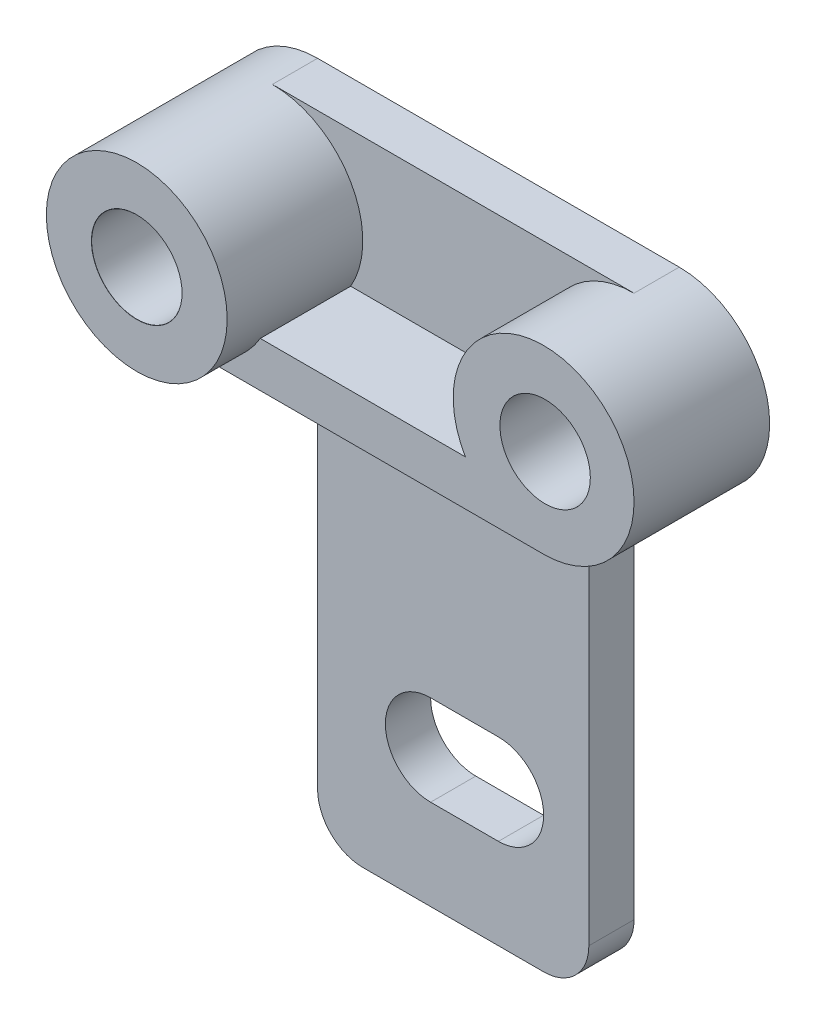
ISO-10303-21;
HEADER;
FILE_DESCRIPTION(('STEP AP214'),'2;1');
FILE_NAME('part.step','',(''),(''),'','','');
FILE_SCHEMA(('AUTOMOTIVE_DESIGN { 1 0 10303 214 1 1 1 1 }'));
ENDSEC;
DATA;
#1=APPLICATION_CONTEXT('core data for automotive mechanical design processes');
#2=APPLICATION_PROTOCOL_DEFINITION('international standard','automotive_design',2000,#1);
#3=PRODUCT_CONTEXT('',#1,'mechanical');
#4=PRODUCT('Part','Part','',(#3));
#5=PRODUCT_RELATED_PRODUCT_CATEGORY('part','',(#4));
#6=PRODUCT_DEFINITION_FORMATION('','',#4);
#7=PRODUCT_DEFINITION_CONTEXT('part definition',#1,'design');
#8=PRODUCT_DEFINITION('design','',#6,#7);
#9=PRODUCT_DEFINITION_SHAPE('','',#8);
#10=(LENGTH_UNIT() NAMED_UNIT(*) SI_UNIT(.MILLI.,.METRE.));
#11=(NAMED_UNIT(*) PLANE_ANGLE_UNIT() SI_UNIT($,.RADIAN.));
#12=(NAMED_UNIT(*) SI_UNIT($,.STERADIAN.) SOLID_ANGLE_UNIT());
#13=UNCERTAINTY_MEASURE_WITH_UNIT(LENGTH_MEASURE(1.E-05),#10,'distance_accuracy_value','');
#14=(GEOMETRIC_REPRESENTATION_CONTEXT(3) GLOBAL_UNCERTAINTY_ASSIGNED_CONTEXT((#13)) GLOBAL_UNIT_ASSIGNED_CONTEXT((#10,
#11,#12)) REPRESENTATION_CONTEXT('',''));
#15=CARTESIAN_POINT('',(0.,0.,0.));
#16=DIRECTION('',(0.,0.,1.));
#17=DIRECTION('',(1.,0.,0.));
#18=AXIS2_PLACEMENT_3D('',#15,#16,#17);
#19=CARTESIAN_POINT('',(-40.,0.,40.));
#20=DIRECTION('',(0.,0.,-1.));
#21=DIRECTION('',(-1.,0.,0.));
#22=AXIS2_PLACEMENT_3D('',#19,#20,#21);
#23=CYLINDRICAL_SURFACE('',#22,20.);
#24=CARTESIAN_POINT('',(-40.,0.,30.));
#25=DIRECTION('',(0.,0.,1.));
#26=DIRECTION('',(1.,0.,0.));
#27=AXIS2_PLACEMENT_3D('',#24,#25,#26);
#28=CIRCLE('',#27,20.);
#29=CARTESIAN_POINT('',(-40.,-20.,30.));
#30=VERTEX_POINT('',#29);
#31=CARTESIAN_POINT('',(-22.6794919243112,-10.,30.));
#32=VERTEX_POINT('',#31);
#33=EDGE_CURVE('E277',#30,#32,#28,.T.);
#34=ORIENTED_EDGE('',*,*,#33,.T.);
#35=DIRECTION('',(0.,0.,-1.));
#36=VECTOR('',#35,1.);
#37=CARTESIAN_POINT('',(-22.6794919243112,-10.,40.));
#38=LINE('',#37,#36);
#39=CARTESIAN_POINT('',(-22.6794919243112,-10.,10.));
#40=VERTEX_POINT('',#39);
#41=EDGE_CURVE('E273',#32,#40,#38,.T.);
#42=ORIENTED_EDGE('',*,*,#41,.T.);
#43=CARTESIAN_POINT('',(-40.,0.,10.));
#44=DIRECTION('',(0.,0.,-1.));
#45=DIRECTION('',(-1.,0.,0.));
#46=AXIS2_PLACEMENT_3D('',#43,#44,#45);
#47=CIRCLE('',#46,20.);
#48=CARTESIAN_POINT('',(-40.,20.,10.));
#49=VERTEX_POINT('',#48);
#50=EDGE_CURVE('E322',#49,#40,#47,.T.);
#51=ORIENTED_EDGE('',*,*,#50,.F.);
#52=DIRECTION('',(0.,0.,-1.));
#53=VECTOR('',#52,1.);
#54=CARTESIAN_POINT('',(-40.,20.,10.));
#55=LINE('',#54,#53);
#56=CARTESIAN_POINT('',(-40.,20.,0.));
#57=VERTEX_POINT('',#56);
#58=EDGE_CURVE('E307',#49,#57,#55,.T.);
#59=ORIENTED_EDGE('',*,*,#58,.T.);
#60=CARTESIAN_POINT('',(-40.,0.,0.));
#61=DIRECTION('',(0.,0.,1.));
#62=DIRECTION('',(1.,0.,0.));
#63=AXIS2_PLACEMENT_3D('',#60,#61,#62);
#64=CIRCLE('',#63,20.);
#65=CARTESIAN_POINT('',(-40.,-20.,0.));
#66=VERTEX_POINT('',#65);
#67=EDGE_CURVE('E306',#57,#66,#64,.T.);
#68=ORIENTED_EDGE('',*,*,#67,.T.);
#69=DIRECTION('',(0.,0.,-1.));
#70=VECTOR('',#69,1.);
#71=CARTESIAN_POINT('',(-40.,-20.,10.));
#72=LINE('',#71,#70);
#73=EDGE_CURVE('E311',#30,#66,#72,.T.);
#74=ORIENTED_EDGE('',*,*,#73,.F.);
#75=EDGE_LOOP('',(#34,#42,#51,#59,#68,#74));
#76=FACE_BOUND('',#75,.T.);
#77=CARTESIAN_POINT('',(-40.,0.,40.));
#78=DIRECTION('',(0.,0.,1.));
#79=DIRECTION('',(1.,0.,0.));
#80=AXIS2_PLACEMENT_3D('',#77,#78,#79);
#81=CIRCLE('',#80,20.);
#82=CARTESIAN_POINT('',(-20.,0.,40.));
#83=VERTEX_POINT('',#82);
#84=EDGE_CURVE('E318',#83,#83,#81,.T.);
#85=ORIENTED_EDGE('',*,*,#84,.F.);
#86=EDGE_LOOP('',(#85));
#87=FACE_BOUND('',#86,.T.);
#88=ADVANCED_FACE('F45',(#76,#87),#23,.T.);
#89=CARTESIAN_POINT('',(-40.,0.,40.));
#90=DIRECTION('',(0.,0.,1.));
#91=DIRECTION('',(1.,0.,0.));
#92=AXIS2_PLACEMENT_3D('',#89,#90,#91);
#93=PLANE('',#92);
#94=CARTESIAN_POINT('',(-40.,0.,40.));
#95=DIRECTION('',(0.,0.,1.));
#96=DIRECTION('',(1.,0.,0.));
#97=AXIS2_PLACEMENT_3D('',#94,#95,#96);
#98=CIRCLE('',#97,10.025);
#99=CARTESIAN_POINT('',(-29.975,0.,40.));
#100=VERTEX_POINT('',#99);
#101=EDGE_CURVE('E234',#100,#100,#98,.T.);
#102=ORIENTED_EDGE('',*,*,#101,.F.);
#103=EDGE_LOOP('',(#102));
#104=FACE_BOUND('',#103,.T.);
#105=ORIENTED_EDGE('',*,*,#84,.T.);
#106=EDGE_LOOP('',(#105));
#107=FACE_BOUND('',#106,.T.);
#108=ADVANCED_FACE('F408',(#104,#107),#93,.T.);
#109=CARTESIAN_POINT('',(-40.,0.,0.));
#110=DIRECTION('',(0.,0.,1.));
#111=DIRECTION('',(1.,0.,0.));
#112=AXIS2_PLACEMENT_3D('',#109,#110,#111);
#113=PLANE('',#112);
#114=DIRECTION('',(1.,0.,0.));
#115=VECTOR('',#114,1.);
#116=CARTESIAN_POINT('',(-5.,-80.,0.));
#117=LINE('',#116,#115);
#118=CARTESIAN_POINT('',(-5.,-80.,0.));
#119=VERTEX_POINT('',#118);
#120=CARTESIAN_POINT('',(10.,-80.,0.));
#121=VERTEX_POINT('',#120);
#122=EDGE_CURVE('E180',#119,#121,#117,.T.);
#123=ORIENTED_EDGE('',*,*,#122,.F.);
#124=CARTESIAN_POINT('',(-5.,-90.,0.));
#125=DIRECTION('',(0.,0.,1.));
#126=DIRECTION('',(1.,0.,0.));
#127=AXIS2_PLACEMENT_3D('',#124,#125,#126);
#128=CIRCLE('',#127,9.99999999999999);
#129=CARTESIAN_POINT('',(-5.,-100.,0.));
#130=VERTEX_POINT('',#129);
#131=EDGE_CURVE('E160',#130,#119,#128,.F.);
#132=ORIENTED_EDGE('',*,*,#131,.F.);
#133=DIRECTION('',(-1.,0.,0.));
#134=VECTOR('',#133,1.);
#135=CARTESIAN_POINT('',(-5.,-100.,0.));
#136=LINE('',#135,#134);
#137=CARTESIAN_POINT('',(9.99999999999999,-100.,0.));
#138=VERTEX_POINT('',#137);
#139=EDGE_CURVE('E170',#138,#130,#136,.T.);
#140=ORIENTED_EDGE('',*,*,#139,.F.);
#141=CARTESIAN_POINT('',(10.,-90.,0.));
#142=DIRECTION('',(0.,0.,1.));
#143=DIRECTION('',(1.,0.,0.));
#144=AXIS2_PLACEMENT_3D('',#141,#142,#143);
#145=CIRCLE('',#144,9.99999999999999);
#146=EDGE_CURVE('E61',#121,#138,#145,.F.);
#147=ORIENTED_EDGE('',*,*,#146,.F.);
#148=EDGE_LOOP('',(#123,#132,#140,#147));
#149=FACE_BOUND('',#148,.T.);
#150=CARTESIAN_POINT('',(-40.,0.,0.));
#151=DIRECTION('',(0.,0.,1.));
#152=DIRECTION('',(1.,0.,0.));
#153=AXIS2_PLACEMENT_3D('',#150,#151,#152);
#154=CIRCLE('',#153,9.99999999999999);
#155=CARTESIAN_POINT('',(-30.,0.,0.));
#156=VERTEX_POINT('',#155);
#157=EDGE_CURVE('E245',#156,#156,#154,.T.);
#158=ORIENTED_EDGE('',*,*,#157,.T.);
#159=EDGE_LOOP('',(#158));
#160=FACE_BOUND('',#159,.T.);
#161=CARTESIAN_POINT('',(40.3313513238807,-0.177410636321921,0.));
#162=DIRECTION('',(0.,0.,1.));
#163=DIRECTION('',(1.,0.,0.));
#164=AXIS2_PLACEMENT_3D('',#161,#162,#163);
#165=CIRCLE('',#164,9.99999999999999);
#166=CARTESIAN_POINT('',(50.3313513238806,-0.177410636321921,0.));
#167=VERTEX_POINT('',#166);
#168=EDGE_CURVE('E249',#167,#167,#165,.T.);
#169=ORIENTED_EDGE('',*,*,#168,.T.);
#170=EDGE_LOOP('',(#169));
#171=FACE_BOUND('',#170,.T.);
#172=DIRECTION('',(0.,-1.,0.));
#173=VECTOR('',#172,1.);
#174=CARTESIAN_POINT('',(30.,-20.,0.));
#175=LINE('',#174,#173);
#176=CARTESIAN_POINT('',(30.,-20.,0.));
#177=VERTEX_POINT('',#176);
#178=CARTESIAN_POINT('',(30.,-110.,0.));
#179=VERTEX_POINT('',#178);
#180=EDGE_CURVE('E174',#177,#179,#175,.T.);
#181=ORIENTED_EDGE('',*,*,#180,.T.);
#182=CARTESIAN_POINT('',(20.,-110.,0.));
#183=DIRECTION('',(0.,0.,1.));
#184=DIRECTION('',(1.,0.,0.));
#185=AXIS2_PLACEMENT_3D('',#182,#183,#184);
#186=CIRCLE('',#185,10.);
#187=CARTESIAN_POINT('',(20.,-120.,0.));
#188=VERTEX_POINT('',#187);
#189=EDGE_CURVE('E351',#179,#188,#186,.F.);
#190=ORIENTED_EDGE('',*,*,#189,.T.);
#191=DIRECTION('',(-1.,0.,0.));
#192=VECTOR('',#191,1.);
#193=CARTESIAN_POINT('',(30.,-120.,0.));
#194=LINE('',#193,#192);
#195=CARTESIAN_POINT('',(-20.,-120.,0.));
#196=VERTEX_POINT('',#195);
#197=EDGE_CURVE('E225',#188,#196,#194,.T.);
#198=ORIENTED_EDGE('',*,*,#197,.T.);
#199=CARTESIAN_POINT('',(-20.,-110.,0.));
#200=DIRECTION('',(0.,0.,1.));
#201=DIRECTION('',(1.,0.,0.));
#202=AXIS2_PLACEMENT_3D('',#199,#200,#201);
#203=CIRCLE('',#202,10.);
#204=CARTESIAN_POINT('',(-30.,-110.,0.));
#205=VERTEX_POINT('',#204);
#206=EDGE_CURVE('E337',#196,#205,#203,.F.);
#207=ORIENTED_EDGE('',*,*,#206,.T.);
#208=DIRECTION('',(0.,1.,0.));
#209=VECTOR('',#208,1.);
#210=CARTESIAN_POINT('',(-30.,-20.,0.));
#211=LINE('',#210,#209);
#212=CARTESIAN_POINT('',(-30.,-20.,0.));
#213=VERTEX_POINT('',#212);
#214=EDGE_CURVE('E211',#205,#213,#211,.T.);
#215=ORIENTED_EDGE('',*,*,#214,.T.);
#216=DIRECTION('',(-1.,0.,0.));
#217=VECTOR('',#216,1.);
#218=CARTESIAN_POINT('',(40.,-20.,0.));
#219=LINE('',#218,#217);
#220=EDGE_CURVE('E286',#213,#66,#219,.T.);
#221=ORIENTED_EDGE('',*,*,#220,.T.);
#222=ORIENTED_EDGE('',*,*,#67,.F.);
#223=DIRECTION('',(1.,0.,0.));
#224=VECTOR('',#223,1.);
#225=CARTESIAN_POINT('',(40.,20.,0.));
#226=LINE('',#225,#224);
#227=CARTESIAN_POINT('',(40.,20.,0.));
#228=VERTEX_POINT('',#227);
#229=EDGE_CURVE('E295',#57,#228,#226,.T.);
#230=ORIENTED_EDGE('',*,*,#229,.T.);
#231=CARTESIAN_POINT('',(40.,0.,0.));
#232=DIRECTION('',(0.,0.,1.));
#233=DIRECTION('',(1.,0.,0.));
#234=AXIS2_PLACEMENT_3D('',#231,#232,#233);
#235=CIRCLE('',#234,20.);
#236=CARTESIAN_POINT('',(40.,-20.,0.));
#237=VERTEX_POINT('',#236);
#238=EDGE_CURVE('E281',#237,#228,#235,.T.);
#239=ORIENTED_EDGE('',*,*,#238,.F.);
#240=EDGE_CURVE('E296',#237,#177,#219,.T.);
#241=ORIENTED_EDGE('',*,*,#240,.T.);
#242=EDGE_LOOP('',(#181,#190,#198,#207,#215,#221,#222,#230,#239,#241));
#243=FACE_BOUND('',#242,.T.);
#244=ADVANCED_FACE('F177',(#149,#160,#171,#243),#113,.F.);
#245=CARTESIAN_POINT('',(40.,20.,10.));
#246=DIRECTION('',(0.,1.,0.));
#247=DIRECTION('',(0.,0.,1.));
#248=AXIS2_PLACEMENT_3D('',#245,#246,#247);
#249=PLANE('',#248);
#250=ORIENTED_EDGE('',*,*,#229,.F.);
#251=ORIENTED_EDGE('',*,*,#58,.F.);
#252=DIRECTION('',(1.,0.,0.));
#253=VECTOR('',#252,1.);
#254=CARTESIAN_POINT('',(40.,20.,10.));
#255=LINE('',#254,#253);
#256=CARTESIAN_POINT('',(40.,20.,10.));
#257=VERTEX_POINT('',#256);
#258=EDGE_CURVE('E290',#49,#257,#255,.T.);
#259=ORIENTED_EDGE('',*,*,#258,.T.);
#260=DIRECTION('',(0.,0.,-1.));
#261=VECTOR('',#260,1.);
#262=CARTESIAN_POINT('',(40.,20.,10.));
#263=LINE('',#262,#261);
#264=EDGE_CURVE('E303',#257,#228,#263,.T.);
#265=ORIENTED_EDGE('',*,*,#264,.T.);
#266=EDGE_LOOP('',(#250,#251,#259,#265));
#267=FACE_BOUND('',#266,.T.);
#268=ADVANCED_FACE('F418',(#267),#249,.T.);
#269=CARTESIAN_POINT('',(40.,-20.,10.));
#270=DIRECTION('',(0.,-1.,0.));
#271=DIRECTION('',(0.,0.,-1.));
#272=AXIS2_PLACEMENT_3D('',#269,#270,#271);
#273=PLANE('',#272);
#274=DIRECTION('',(0.,0.,-1.));
#275=VECTOR('',#274,1.);
#276=CARTESIAN_POINT('',(30.,-20.,10.));
#277=LINE('',#276,#275);
#278=CARTESIAN_POINT('',(30.,-20.,10.));
#279=VERTEX_POINT('',#278);
#280=EDGE_CURVE('E230',#279,#177,#277,.T.);
#281=ORIENTED_EDGE('',*,*,#280,.T.);
#282=ORIENTED_EDGE('',*,*,#240,.F.);
#283=DIRECTION('',(0.,0.,-1.));
#284=VECTOR('',#283,1.);
#285=CARTESIAN_POINT('',(40.,-20.,10.));
#286=LINE('',#285,#284);
#287=CARTESIAN_POINT('',(40.,-20.,30.));
#288=VERTEX_POINT('',#287);
#289=EDGE_CURVE('E294',#288,#237,#286,.T.);
#290=ORIENTED_EDGE('',*,*,#289,.F.);
#291=DIRECTION('',(1.,0.,0.));
#292=VECTOR('',#291,1.);
#293=CARTESIAN_POINT('',(-40.,-20.,30.));
#294=LINE('',#293,#292);
#295=EDGE_CURVE('E257',#30,#288,#294,.T.);
#296=ORIENTED_EDGE('',*,*,#295,.F.);
#297=ORIENTED_EDGE('',*,*,#73,.T.);
#298=ORIENTED_EDGE('',*,*,#220,.F.);
#299=DIRECTION('',(0.,0.,-1.));
#300=VECTOR('',#299,1.);
#301=CARTESIAN_POINT('',(-30.,-20.,10.));
#302=LINE('',#301,#300);
#303=CARTESIAN_POINT('',(-30.,-20.,10.));
#304=VERTEX_POINT('',#303);
#305=EDGE_CURVE('E221',#304,#213,#302,.T.);
#306=ORIENTED_EDGE('',*,*,#305,.F.);
#307=DIRECTION('',(1.,0.,0.));
#308=VECTOR('',#307,1.);
#309=CARTESIAN_POINT('',(30.,-20.,10.));
#310=LINE('',#309,#308);
#311=EDGE_CURVE('E217',#304,#279,#310,.T.);
#312=ORIENTED_EDGE('',*,*,#311,.T.);
#313=EDGE_LOOP('',(#281,#282,#290,#296,#297,#298,#306,#312));
#314=FACE_BOUND('',#313,.T.);
#315=ADVANCED_FACE('F373',(#314),#273,.T.);
#316=CARTESIAN_POINT('',(0.,0.,10.));
#317=DIRECTION('',(0.,0.,-1.));
#318=DIRECTION('',(-1.,0.,0.));
#319=AXIS2_PLACEMENT_3D('',#316,#317,#318);
#320=PLANE('',#319);
#321=ORIENTED_EDGE('',*,*,#50,.T.);
#322=DIRECTION('',(1.,0.,0.));
#323=VECTOR('',#322,1.);
#324=CARTESIAN_POINT('',(0.,-10.,10.));
#325=LINE('',#324,#323);
#326=CARTESIAN_POINT('',(22.6794919243112,-10.,10.));
#327=VERTEX_POINT('',#326);
#328=EDGE_CURVE('E269',#40,#327,#325,.T.);
#329=ORIENTED_EDGE('',*,*,#328,.T.);
#330=CARTESIAN_POINT('',(40.,0.,10.));
#331=DIRECTION('',(0.,0.,-1.));
#332=DIRECTION('',(-1.,0.,0.));
#333=AXIS2_PLACEMENT_3D('',#330,#331,#332);
#334=CIRCLE('',#333,20.);
#335=EDGE_CURVE('E329',#257,#327,#334,.F.);
#336=ORIENTED_EDGE('',*,*,#335,.F.);
#337=ORIENTED_EDGE('',*,*,#258,.F.);
#338=EDGE_LOOP('',(#321,#329,#336,#337));
#339=FACE_BOUND('',#338,.T.);
#340=ADVANCED_FACE('F422',(#339),#320,.F.);
#341=CARTESIAN_POINT('',(40.,0.,30.));
#342=DIRECTION('',(0.,0.,-1.));
#343=DIRECTION('',(-1.,0.,0.));
#344=AXIS2_PLACEMENT_3D('',#341,#342,#343);
#345=CYLINDRICAL_SURFACE('',#344,20.);
#346=ORIENTED_EDGE('',*,*,#335,.T.);
#347=DIRECTION('',(0.,0.,-1.));
#348=VECTOR('',#347,1.);
#349=CARTESIAN_POINT('',(22.6794919243112,-10.,30.));
#350=LINE('',#349,#348);
#351=CARTESIAN_POINT('',(22.6794919243112,-10.,30.));
#352=VERTEX_POINT('',#351);
#353=EDGE_CURVE('E265',#327,#352,#350,.F.);
#354=ORIENTED_EDGE('',*,*,#353,.T.);
#355=CARTESIAN_POINT('',(40.,0.,30.));
#356=DIRECTION('',(0.,0.,1.));
#357=DIRECTION('',(1.,0.,0.));
#358=AXIS2_PLACEMENT_3D('',#355,#356,#357);
#359=CIRCLE('',#358,20.);
#360=EDGE_CURVE('E282',#288,#352,#359,.T.);
#361=ORIENTED_EDGE('',*,*,#360,.F.);
#362=ORIENTED_EDGE('',*,*,#289,.T.);
#363=ORIENTED_EDGE('',*,*,#238,.T.);
#364=ORIENTED_EDGE('',*,*,#264,.F.);
#365=EDGE_LOOP('',(#346,#354,#361,#362,#363,#364));
#366=FACE_BOUND('',#365,.T.);
#367=ADVANCED_FACE('F377',(#366),#345,.T.);
#368=CARTESIAN_POINT('',(40.,0.,30.));
#369=DIRECTION('',(0.,0.,1.));
#370=DIRECTION('',(1.,0.,0.));
#371=AXIS2_PLACEMENT_3D('',#368,#369,#370);
#372=PLANE('',#371);
#373=CARTESIAN_POINT('',(40.3313513238807,-0.177410636321921,30.));
#374=DIRECTION('',(0.,0.,1.));
#375=DIRECTION('',(1.,0.,0.));
#376=AXIS2_PLACEMENT_3D('',#373,#374,#375);
#377=CIRCLE('',#376,9.99999999999999);
#378=CARTESIAN_POINT('',(50.3313513238807,-0.177410636321921,30.));
#379=VERTEX_POINT('',#378);
#380=EDGE_CURVE('E253',#379,#379,#377,.T.);
#381=ORIENTED_EDGE('',*,*,#380,.F.);
#382=EDGE_LOOP('',(#381));
#383=FACE_BOUND('',#382,.T.);
#384=ORIENTED_EDGE('',*,*,#360,.T.);
#385=DIRECTION('',(-1.,0.,0.));
#386=VECTOR('',#385,1.);
#387=CARTESIAN_POINT('',(-40.,-10.,30.));
#388=LINE('',#387,#386);
#389=EDGE_CURVE('E261',#352,#32,#388,.T.);
#390=ORIENTED_EDGE('',*,*,#389,.T.);
#391=ORIENTED_EDGE('',*,*,#33,.F.);
#392=ORIENTED_EDGE('',*,*,#295,.T.);
#393=EDGE_LOOP('',(#384,#390,#391,#392));
#394=FACE_BOUND('',#393,.T.);
#395=ADVANCED_FACE('F380',(#383,#394),#372,.T.);
#396=CARTESIAN_POINT('',(-40.,-10.,0.));
#397=DIRECTION('',(0.,1.,0.));
#398=DIRECTION('',(0.,0.,1.));
#399=AXIS2_PLACEMENT_3D('',#396,#397,#398);
#400=PLANE('',#399);
#401=ORIENTED_EDGE('',*,*,#41,.F.);
#402=ORIENTED_EDGE('',*,*,#389,.F.);
#403=ORIENTED_EDGE('',*,*,#353,.F.);
#404=ORIENTED_EDGE('',*,*,#328,.F.);
#405=EDGE_LOOP('',(#401,#402,#403,#404));
#406=FACE_BOUND('',#405,.T.);
#407=ADVANCED_FACE('F431',(#406),#400,.T.);
#408=CARTESIAN_POINT('',(40.3313513238807,-0.177410636321921,40.));
#409=DIRECTION('',(0.,0.,1.));
#410=DIRECTION('',(1.,0.,0.));
#411=AXIS2_PLACEMENT_3D('',#408,#409,#410);
#412=CYLINDRICAL_SURFACE('',#411,9.99999999999999);
#413=ORIENTED_EDGE('',*,*,#380,.T.);
#414=EDGE_LOOP('',(#413));
#415=FACE_BOUND('',#414,.T.);
#416=ORIENTED_EDGE('',*,*,#168,.F.);
#417=EDGE_LOOP('',(#416));
#418=FACE_BOUND('',#417,.T.);
#419=ADVANCED_FACE('F435',(#415,#418),#412,.F.);
#420=CARTESIAN_POINT('',(-40.,0.,40.));
#421=DIRECTION('',(0.,0.,1.));
#422=DIRECTION('',(1.,0.,0.));
#423=AXIS2_PLACEMENT_3D('',#420,#421,#422);
#424=CYLINDRICAL_SURFACE('',#423,9.99999999999999);
#425=ORIENTED_EDGE('',*,*,#157,.F.);
#426=EDGE_LOOP('',(#425));
#427=FACE_BOUND('',#426,.T.);
#428=CARTESIAN_POINT('',(-40.,0.,39.975));
#429=DIRECTION('',(0.,0.,1.));
#430=DIRECTION('',(1.,0.,0.));
#431=AXIS2_PLACEMENT_3D('',#428,#429,#430);
#432=CIRCLE('',#431,9.99999999999999);
#433=CARTESIAN_POINT('',(-30.,0.,39.975));
#434=VERTEX_POINT('',#433);
#435=EDGE_CURVE('E241',#434,#434,#432,.T.);
#436=ORIENTED_EDGE('',*,*,#435,.T.);
#437=EDGE_LOOP('',(#436));
#438=FACE_BOUND('',#437,.T.);
#439=ADVANCED_FACE('F439',(#427,#438),#424,.F.);
#440=CARTESIAN_POINT('',(-40.,0.,40.));
#441=DIRECTION('',(0.,0.,1.));
#442=DIRECTION('',(1.,0.,0.));
#443=AXIS2_PLACEMENT_3D('',#440,#441,#442);
#444=CONICAL_SURFACE('',#443,10.025,0.785398163397448);
#445=ORIENTED_EDGE('',*,*,#435,.F.);
#446=EDGE_LOOP('',(#445));
#447=FACE_BOUND('',#446,.T.);
#448=ORIENTED_EDGE('',*,*,#101,.T.);
#449=EDGE_LOOP('',(#448));
#450=FACE_BOUND('',#449,.T.);
#451=ADVANCED_FACE('F443',(#447,#450),#444,.F.);
#452=CARTESIAN_POINT('',(30.,-20.,10.));
#453=DIRECTION('',(1.,0.,0.));
#454=DIRECTION('',(0.,1.,0.));
#455=AXIS2_PLACEMENT_3D('',#452,#453,#454);
#456=PLANE('',#455);
#457=DIRECTION('',(0.,-1.,0.));
#458=VECTOR('',#457,1.);
#459=CARTESIAN_POINT('',(30.,-20.,10.));
#460=LINE('',#459,#458);
#461=CARTESIAN_POINT('',(30.,-110.,10.));
#462=VERTEX_POINT('',#461);
#463=EDGE_CURVE('E206',#279,#462,#460,.T.);
#464=ORIENTED_EDGE('',*,*,#463,.T.);
#465=DIRECTION('',(0.,0.,-1.));
#466=VECTOR('',#465,1.);
#467=CARTESIAN_POINT('',(30.,-110.,10.));
#468=LINE('',#467,#466);
#469=EDGE_CURVE('E347',#462,#179,#468,.T.);
#470=ORIENTED_EDGE('',*,*,#469,.T.);
#471=ORIENTED_EDGE('',*,*,#180,.F.);
#472=ORIENTED_EDGE('',*,*,#280,.F.);
#473=EDGE_LOOP('',(#464,#470,#471,#472));
#474=FACE_BOUND('',#473,.T.);
#475=ADVANCED_FACE('F369',(#474),#456,.T.);
#476=CARTESIAN_POINT('',(-30.,-20.,10.));
#477=DIRECTION('',(-1.,0.,0.));
#478=DIRECTION('',(0.,-1.,0.));
#479=AXIS2_PLACEMENT_3D('',#476,#477,#478);
#480=PLANE('',#479);
#481=ORIENTED_EDGE('',*,*,#214,.F.);
#482=DIRECTION('',(0.,0.,-1.));
#483=VECTOR('',#482,1.);
#484=CARTESIAN_POINT('',(-30.,-110.,10.));
#485=LINE('',#484,#483);
#486=CARTESIAN_POINT('',(-30.,-110.,10.));
#487=VERTEX_POINT('',#486);
#488=EDGE_CURVE('E340',#205,#487,#485,.F.);
#489=ORIENTED_EDGE('',*,*,#488,.T.);
#490=DIRECTION('',(0.,1.,0.));
#491=VECTOR('',#490,1.);
#492=CARTESIAN_POINT('',(-30.,-20.,10.));
#493=LINE('',#492,#491);
#494=EDGE_CURVE('E214',#487,#304,#493,.T.);
#495=ORIENTED_EDGE('',*,*,#494,.T.);
#496=ORIENTED_EDGE('',*,*,#305,.T.);
#497=EDGE_LOOP('',(#481,#489,#495,#496));
#498=FACE_BOUND('',#497,.T.);
#499=ADVANCED_FACE('F393',(#498),#480,.T.);
#500=CARTESIAN_POINT('',(30.,-120.,10.));
#501=DIRECTION('',(0.,-1.,0.));
#502=DIRECTION('',(0.,0.,-1.));
#503=AXIS2_PLACEMENT_3D('',#500,#501,#502);
#504=PLANE('',#503);
#505=ORIENTED_EDGE('',*,*,#197,.F.);
#506=DIRECTION('',(0.,0.,-1.));
#507=VECTOR('',#506,1.);
#508=CARTESIAN_POINT('',(20.,-120.,10.));
#509=LINE('',#508,#507);
#510=CARTESIAN_POINT('',(20.,-120.,10.));
#511=VERTEX_POINT('',#510);
#512=EDGE_CURVE('E54',#188,#511,#509,.F.);
#513=ORIENTED_EDGE('',*,*,#512,.T.);
#514=DIRECTION('',(-1.,0.,0.));
#515=VECTOR('',#514,1.);
#516=CARTESIAN_POINT('',(30.,-120.,10.));
#517=LINE('',#516,#515);
#518=CARTESIAN_POINT('',(-20.,-120.,10.));
#519=VERTEX_POINT('',#518);
#520=EDGE_CURVE('E210',#511,#519,#517,.T.);
#521=ORIENTED_EDGE('',*,*,#520,.T.);
#522=DIRECTION('',(0.,0.,-1.));
#523=VECTOR('',#522,1.);
#524=CARTESIAN_POINT('',(-20.,-120.,10.));
#525=LINE('',#524,#523);
#526=EDGE_CURVE('E333',#519,#196,#525,.T.);
#527=ORIENTED_EDGE('',*,*,#526,.T.);
#528=EDGE_LOOP('',(#505,#513,#521,#527));
#529=FACE_BOUND('',#528,.T.);
#530=ADVANCED_FACE('F358',(#529),#504,.T.);
#531=CARTESIAN_POINT('',(0.,0.,10.));
#532=DIRECTION('',(0.,0.,-1.));
#533=DIRECTION('',(-1.,0.,0.));
#534=AXIS2_PLACEMENT_3D('',#531,#532,#533);
#535=PLANE('',#534);
#536=DIRECTION('',(1.,0.,0.));
#537=VECTOR('',#536,1.);
#538=CARTESIAN_POINT('',(-5.,-100.,10.));
#539=LINE('',#538,#537);
#540=CARTESIAN_POINT('',(-5.,-100.,10.));
#541=VERTEX_POINT('',#540);
#542=CARTESIAN_POINT('',(10.,-100.,10.));
#543=VERTEX_POINT('',#542);
#544=EDGE_CURVE('E185',#541,#543,#539,.T.);
#545=ORIENTED_EDGE('',*,*,#544,.F.);
#546=CARTESIAN_POINT('',(-5.,-90.,10.));
#547=DIRECTION('',(0.,0.,1.));
#548=DIRECTION('',(1.,0.,0.));
#549=AXIS2_PLACEMENT_3D('',#546,#547,#548);
#550=CIRCLE('',#549,9.99999999999999);
#551=CARTESIAN_POINT('',(-5.,-80.,10.));
#552=VERTEX_POINT('',#551);
#553=EDGE_CURVE('E69',#552,#541,#550,.T.);
#554=ORIENTED_EDGE('',*,*,#553,.F.);
#555=DIRECTION('',(-1.,0.,0.));
#556=VECTOR('',#555,1.);
#557=CARTESIAN_POINT('',(-5.,-80.,10.));
#558=LINE('',#557,#556);
#559=CARTESIAN_POINT('',(10.,-80.,10.));
#560=VERTEX_POINT('',#559);
#561=EDGE_CURVE('E167',#560,#552,#558,.T.);
#562=ORIENTED_EDGE('',*,*,#561,.F.);
#563=CARTESIAN_POINT('',(10.,-90.,10.));
#564=DIRECTION('',(0.,0.,1.));
#565=DIRECTION('',(1.,0.,0.));
#566=AXIS2_PLACEMENT_3D('',#563,#564,#565);
#567=CIRCLE('',#566,9.99999999999999);
#568=EDGE_CURVE('E192',#543,#560,#567,.T.);
#569=ORIENTED_EDGE('',*,*,#568,.F.);
#570=EDGE_LOOP('',(#545,#554,#562,#569));
#571=FACE_BOUND('',#570,.T.);
#572=ORIENTED_EDGE('',*,*,#520,.F.);
#573=CARTESIAN_POINT('',(20.,-110.,10.));
#574=DIRECTION('',(0.,0.,-1.));
#575=DIRECTION('',(-1.,0.,0.));
#576=AXIS2_PLACEMENT_3D('',#573,#574,#575);
#577=CIRCLE('',#576,10.);
#578=EDGE_CURVE('E11',#511,#462,#577,.F.);
#579=ORIENTED_EDGE('',*,*,#578,.T.);
#580=ORIENTED_EDGE('',*,*,#463,.F.);
#581=ORIENTED_EDGE('',*,*,#311,.F.);
#582=ORIENTED_EDGE('',*,*,#494,.F.);
#583=CARTESIAN_POINT('',(-20.,-110.,10.));
#584=DIRECTION('',(0.,0.,-1.));
#585=DIRECTION('',(-1.,0.,0.));
#586=AXIS2_PLACEMENT_3D('',#583,#584,#585);
#587=CIRCLE('',#586,10.);
#588=EDGE_CURVE('E343',#487,#519,#587,.F.);
#589=ORIENTED_EDGE('',*,*,#588,.T.);
#590=EDGE_LOOP('',(#572,#579,#580,#581,#582,#589));
#591=FACE_BOUND('',#590,.T.);
#592=ADVANCED_FACE('F362',(#571,#591),#535,.F.);
#593=CARTESIAN_POINT('',(-20.,-110.,10.));
#594=DIRECTION('',(0.,0.,-1.));
#595=DIRECTION('',(-1.,0.,0.));
#596=AXIS2_PLACEMENT_3D('',#593,#594,#595);
#597=CYLINDRICAL_SURFACE('',#596,10.);
#598=ORIENTED_EDGE('',*,*,#588,.F.);
#599=ORIENTED_EDGE('',*,*,#488,.F.);
#600=ORIENTED_EDGE('',*,*,#206,.F.);
#601=ORIENTED_EDGE('',*,*,#526,.F.);
#602=EDGE_LOOP('',(#598,#599,#600,#601));
#603=FACE_BOUND('',#602,.T.);
#604=ADVANCED_FACE('F396',(#603),#597,.T.);
#605=CARTESIAN_POINT('',(20.,-110.,10.));
#606=DIRECTION('',(0.,0.,-1.));
#607=DIRECTION('',(-1.,0.,0.));
#608=AXIS2_PLACEMENT_3D('',#605,#606,#607);
#609=CYLINDRICAL_SURFACE('',#608,10.);
#610=ORIENTED_EDGE('',*,*,#578,.F.);
#611=ORIENTED_EDGE('',*,*,#512,.F.);
#612=ORIENTED_EDGE('',*,*,#189,.F.);
#613=ORIENTED_EDGE('',*,*,#469,.F.);
#614=EDGE_LOOP('',(#610,#611,#612,#613));
#615=FACE_BOUND('',#614,.T.);
#616=ADVANCED_FACE('F47',(#615),#609,.T.);
#617=CARTESIAN_POINT('',(-5.,-90.,-0.000999999999999265));
#618=DIRECTION('',(0.,0.,1.));
#619=DIRECTION('',(1.,0.,0.));
#620=AXIS2_PLACEMENT_3D('',#617,#618,#619);
#621=CYLINDRICAL_SURFACE('',#620,9.99999999999999);
#622=ORIENTED_EDGE('',*,*,#131,.T.);
#623=DIRECTION('',(0.,0.,1.));
#624=VECTOR('',#623,1.);
#625=CARTESIAN_POINT('',(-5.,-80.,-0.000999999999999265));
#626=LINE('',#625,#624);
#627=EDGE_CURVE('E175',#119,#552,#626,.T.);
#628=ORIENTED_EDGE('',*,*,#627,.T.);
#629=ORIENTED_EDGE('',*,*,#553,.T.);
#630=DIRECTION('',(0.,0.,1.));
#631=VECTOR('',#630,1.);
#632=CARTESIAN_POINT('',(-5.,-100.,-0.000999999999999265));
#633=LINE('',#632,#631);
#634=EDGE_CURVE('E156',#130,#541,#633,.T.);
#635=ORIENTED_EDGE('',*,*,#634,.F.);
#636=EDGE_LOOP('',(#622,#628,#629,#635));
#637=FACE_BOUND('',#636,.T.);
#638=ADVANCED_FACE('F158',(#637),#621,.F.);
#639=CARTESIAN_POINT('',(-5.,-80.,-0.000999999999999265));
#640=DIRECTION('',(0.,1.,0.));
#641=DIRECTION('',(0.,0.,1.));
#642=AXIS2_PLACEMENT_3D('',#639,#640,#641);
#643=PLANE('',#642);
#644=ORIENTED_EDGE('',*,*,#122,.T.);
#645=DIRECTION('',(0.,0.,1.));
#646=VECTOR('',#645,1.);
#647=CARTESIAN_POINT('',(10.,-80.,-0.000999999999999265));
#648=LINE('',#647,#646);
#649=EDGE_CURVE('E201',#121,#560,#648,.T.);
#650=ORIENTED_EDGE('',*,*,#649,.T.);
#651=ORIENTED_EDGE('',*,*,#561,.T.);
#652=ORIENTED_EDGE('',*,*,#627,.F.);
#653=EDGE_LOOP('',(#644,#650,#651,#652));
#654=FACE_BOUND('',#653,.T.);
#655=ADVANCED_FACE('F454',(#654),#643,.F.);
#656=CARTESIAN_POINT('',(10.,-90.,-0.000999999999999265));
#657=DIRECTION('',(0.,0.,1.));
#658=DIRECTION('',(1.,0.,0.));
#659=AXIS2_PLACEMENT_3D('',#656,#657,#658);
#660=CYLINDRICAL_SURFACE('',#659,9.99999999999999);
#661=ORIENTED_EDGE('',*,*,#146,.T.);
#662=DIRECTION('',(0.,0.,1.));
#663=VECTOR('',#662,1.);
#664=CARTESIAN_POINT('',(10.,-100.,-0.000999999999999265));
#665=LINE('',#664,#663);
#666=EDGE_CURVE('E166',#138,#543,#665,.T.);
#667=ORIENTED_EDGE('',*,*,#666,.T.);
#668=ORIENTED_EDGE('',*,*,#568,.T.);
#669=ORIENTED_EDGE('',*,*,#649,.F.);
#670=EDGE_LOOP('',(#661,#667,#668,#669));
#671=FACE_BOUND('',#670,.T.);
#672=ADVANCED_FACE('F457',(#671),#660,.F.);
#673=CARTESIAN_POINT('',(-5.,-100.,-0.000999999999999265));
#674=DIRECTION('',(0.,-1.,0.));
#675=DIRECTION('',(0.,0.,-1.));
#676=AXIS2_PLACEMENT_3D('',#673,#674,#675);
#677=PLANE('',#676);
#678=ORIENTED_EDGE('',*,*,#139,.T.);
#679=ORIENTED_EDGE('',*,*,#634,.T.);
#680=ORIENTED_EDGE('',*,*,#544,.T.);
#681=ORIENTED_EDGE('',*,*,#666,.F.);
#682=EDGE_LOOP('',(#678,#679,#680,#681));
#683=FACE_BOUND('',#682,.T.);
#684=ADVANCED_FACE('F171',(#683),#677,.F.);
#685=CLOSED_SHELL('',(#88,#108,#244,#268,#315,#340,#367,#395,#407,#419,#439,#451,#475,#499,#530,
#592,#604,#616,#638,#655,#672,#684));
#686=MANIFOLD_SOLID_BREP('B2',#685);
#687=ADVANCED_BREP_SHAPE_REPRESENTATION('',(#18,#686),#14);
#688=SHAPE_DEFINITION_REPRESENTATION(#9,#687);
ENDSEC;
END-ISO-10303-21;
